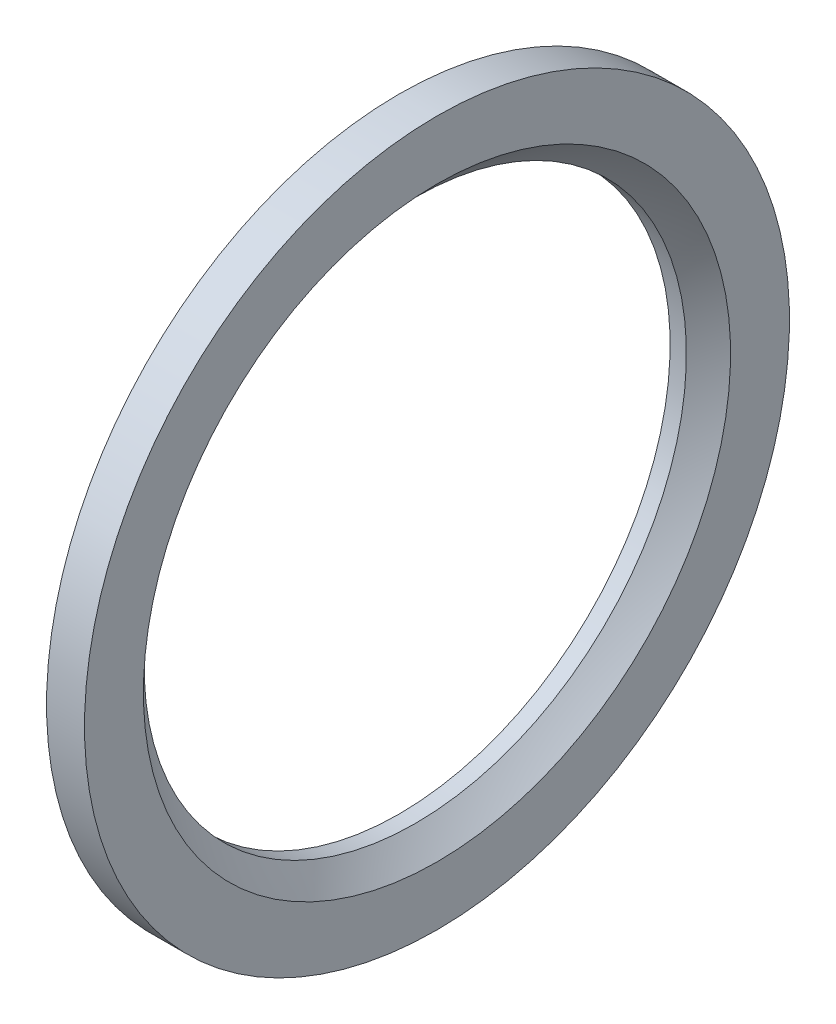
ISO-10303-21;
HEADER;
FILE_DESCRIPTION(('STEP AP214'),'2;1');
FILE_NAME('part.step','',(''),(''),'','','');
FILE_SCHEMA(('AUTOMOTIVE_DESIGN { 1 0 10303 214 1 1 1 1 }'));
ENDSEC;
DATA;
#1=APPLICATION_CONTEXT('core data for automotive mechanical design processes');
#2=APPLICATION_PROTOCOL_DEFINITION('international standard','automotive_design',2000,#1);
#3=PRODUCT_CONTEXT('',#1,'mechanical');
#4=PRODUCT('Part','Part','',(#3));
#5=PRODUCT_RELATED_PRODUCT_CATEGORY('part','',(#4));
#6=PRODUCT_DEFINITION_FORMATION('','',#4);
#7=PRODUCT_DEFINITION_CONTEXT('part definition',#1,'design');
#8=PRODUCT_DEFINITION('design','',#6,#7);
#9=PRODUCT_DEFINITION_SHAPE('','',#8);
#10=(LENGTH_UNIT() NAMED_UNIT(*) SI_UNIT(.MILLI.,.METRE.));
#11=(NAMED_UNIT(*) PLANE_ANGLE_UNIT() SI_UNIT($,.RADIAN.));
#12=(NAMED_UNIT(*) SI_UNIT($,.STERADIAN.) SOLID_ANGLE_UNIT());
#13=UNCERTAINTY_MEASURE_WITH_UNIT(LENGTH_MEASURE(1.E-05),#10,'distance_accuracy_value','');
#14=(GEOMETRIC_REPRESENTATION_CONTEXT(3) GLOBAL_UNCERTAINTY_ASSIGNED_CONTEXT((#13)) GLOBAL_UNIT_ASSIGNED_CONTEXT((#10,
#11,#12)) REPRESENTATION_CONTEXT('',''));
#15=CARTESIAN_POINT('',(0.,0.,0.));
#16=DIRECTION('',(0.,0.,1.));
#17=DIRECTION('',(1.,0.,0.));
#18=AXIS2_PLACEMENT_3D('',#15,#16,#17);
#19=CARTESIAN_POINT('',(0.,0.,0.));
#20=DIRECTION('',(-1.,0.,0.));
#21=DIRECTION('',(0.,-1.,0.));
#22=AXIS2_PLACEMENT_3D('',#19,#20,#21);
#23=CYLINDRICAL_SURFACE('',#22,8.255);
#24=CARTESIAN_POINT('',(0.,0.,0.));
#25=DIRECTION('',(-1.,0.,0.));
#26=DIRECTION('',(0.,-1.,0.));
#27=AXIS2_PLACEMENT_3D('',#24,#25,#26);
#28=CIRCLE('',#27,8.255);
#29=CARTESIAN_POINT('',(0.,-8.255,0.));
#30=VERTEX_POINT('',#29);
#31=EDGE_CURVE('E60',#30,#30,#28,.T.);
#32=ORIENTED_EDGE('',*,*,#31,.F.);
#33=EDGE_LOOP('',(#32));
#34=FACE_BOUND('',#33,.T.);
#35=CARTESIAN_POINT('',(0.889,0.,0.));
#36=DIRECTION('',(-1.,0.,0.));
#37=DIRECTION('',(0.,-1.,0.));
#38=AXIS2_PLACEMENT_3D('',#35,#36,#37);
#39=CIRCLE('',#38,8.255);
#40=CARTESIAN_POINT('',(0.889,-8.255,0.));
#41=VERTEX_POINT('',#40);
#42=EDGE_CURVE('E10',#41,#41,#39,.T.);
#43=ORIENTED_EDGE('',*,*,#42,.T.);
#44=EDGE_LOOP('',(#43));
#45=FACE_BOUND('',#44,.T.);
#46=ADVANCED_FACE('F37',(#34,#45),#23,.T.);
#47=CARTESIAN_POINT('',(0.889,6.87586678767258,0.));
#48=DIRECTION('',(-1.,0.,0.));
#49=DIRECTION('',(0.,-1.,0.));
#50=AXIS2_PLACEMENT_3D('',#47,#48,#49);
#51=PLANE('',#50);
#52=ORIENTED_EDGE('',*,*,#42,.F.);
#53=EDGE_LOOP('',(#52));
#54=FACE_BOUND('',#53,.T.);
#55=CARTESIAN_POINT('',(0.889,0.,0.));
#56=DIRECTION('',(-1.,0.,0.));
#57=DIRECTION('',(0.,-1.,0.));
#58=AXIS2_PLACEMENT_3D('',#55,#56,#57);
#59=CIRCLE('',#58,6.87586678767258);
#60=CARTESIAN_POINT('',(0.889,6.87586678767258,0.));
#61=VERTEX_POINT('',#60);
#62=EDGE_CURVE('E44',#61,#61,#59,.T.);
#63=ORIENTED_EDGE('',*,*,#62,.T.);
#64=EDGE_LOOP('',(#63));
#65=FACE_BOUND('',#64,.T.);
#66=ADVANCED_FACE('F68',(#54,#65),#51,.F.);
#67=CARTESIAN_POINT('',(7.48051582856183,0.,0.));
#68=DIRECTION('',(-1.,0.,0.));
#69=DIRECTION('',(0.,1.,0.));
#70=AXIS2_PLACEMENT_3D('',#67,#68,#69);
#71=SPHERICAL_SURFACE('',#70,9.525);
#72=CARTESIAN_POINT('',(0.381,0.,0.));
#73=DIRECTION('',(-1.,0.,0.));
#74=DIRECTION('',(0.,-1.,0.));
#75=AXIS2_PLACEMENT_3D('',#72,#73,#74);
#76=CIRCLE('',#75,6.35);
#77=CARTESIAN_POINT('',(0.381,6.35,0.));
#78=VERTEX_POINT('',#77);
#79=EDGE_CURVE('E49',#78,#78,#76,.T.);
#80=CARTESIAN_POINT('',(0.889,6.87586678767258,0.));
#81=CARTESIAN_POINT('',(0.883500637455799,6.87059485088315,0.));
#82=CARTESIAN_POINT('',(0.87800759973084,6.86531631642864,0.));
#83=CARTESIAN_POINT('',(0.867034205486401,6.85474608263887,0.));
#84=CARTESIAN_POINT('',(0.861553848966921,6.84945438330361,0.));
#85=CARTESIAN_POINT('',(0.850605848700433,6.83885785020174,0.));
#86=CARTESIAN_POINT('',(0.845138204953426,6.83355301643513,0.));
#87=CARTESIAN_POINT('',(0.834215661706124,6.8229302450159,0.));
#88=CARTESIAN_POINT('',(0.828760762205828,6.81761230736328,0.));
#89=CARTESIAN_POINT('',(0.817863738858063,6.80696335878736,0.));
#90=CARTESIAN_POINT('',(0.812421615010594,6.80163234786407,0.));
#91=CARTESIAN_POINT('',(0.801550174299633,6.79095728343886,0.));
#92=CARTESIAN_POINT('',(0.796120857436141,6.78561322993695,0.));
#93=CARTESIAN_POINT('',(0.785275061950937,6.77491211112126,0.));
#94=CARTESIAN_POINT('',(0.779858583329223,6.76955504580749,0.));
#95=CARTESIAN_POINT('',(0.769038495511359,6.75882793420986,0.));
#96=CARTESIAN_POINT('',(0.763634886315207,6.753457887926,0.));
#97=CARTESIAN_POINT('',(0.752840568458189,6.74270484530468,0.));
#98=CARTESIAN_POINT('',(0.747449859797321,6.73732184896722,0.));
#99=CARTESIAN_POINT('',(0.73668137404631,6.72654293722973,0.));
#100=CARTESIAN_POINT('',(0.731303596956167,6.72114702182971,0.));
#101=CARTESIAN_POINT('',(0.7205610053076,6.71034230303252,0.));
#102=CARTESIAN_POINT('',(0.715196190749176,6.70493349963535,0.));
#103=CARTESIAN_POINT('',(0.704479555050412,6.69410303598349,0.));
#104=CARTESIAN_POINT('',(0.699127733910072,6.6886813757288,0.));
#105=CARTESIAN_POINT('',(0.688437115859037,6.67782522957553,0.));
#106=CARTESIAN_POINT('',(0.683098318948342,6.67239074367695,0.));
#107=CARTESIAN_POINT('',(0.672433780093171,6.66150897752338,0.));
#108=CARTESIAN_POINT('',(0.667108038148696,6.6560616972684,0.));
#109=CARTESIAN_POINT('',(0.656469639887384,6.64515437376316,0.));
#110=CARTESIAN_POINT('',(0.651156983570547,6.6396943305129,0.));
#111=CARTESIAN_POINT('',(0.640544787150588,6.62876151245174,0.));
#112=CARTESIAN_POINT('',(0.635245247047467,6.62328873764083,0.));
#113=CARTESIAN_POINT('',(0.624659313565508,6.61233048796628,0.));
#114=CARTESIAN_POINT('',(0.619372920186671,6.60684501310263,0.));
#115=CARTESIAN_POINT('',(0.608813310588158,6.59586139490364,0.));
#116=CARTESIAN_POINT('',(0.603540094368483,6.59036325156829,0.));
#117=CARTESIAN_POINT('',(0.59300686944731,6.57935432807985,0.));
#118=CARTESIAN_POINT('',(0.587746860745811,6.57384354792676,0.));
#119=CARTESIAN_POINT('',(0.577240081143968,6.56280938252957,0.));
#120=CARTESIAN_POINT('',(0.571993310243623,6.55728599728547,0.));
#121=CARTESIAN_POINT('',(0.561513036450849,6.54622665350554,0.));
#122=CARTESIAN_POINT('',(0.55627953355842,6.54069069496971,0.));
#123=CARTESIAN_POINT('',(0.545825825911855,6.529606236478,0.));
#124=CARTESIAN_POINT('',(0.540605621157719,6.52405773652212,0.));
#125=CARTESIAN_POINT('',(0.530178539841557,6.51294822713419,0.));
#126=CARTESIAN_POINT('',(0.524971663279532,6.50738721770214,0.));
#127=CARTESIAN_POINT('',(0.514571268324673,6.49625272137778,0.));
#128=CARTESIAN_POINT('',(0.50937774993184,6.49067923448547,0.));
#129=CARTESIAN_POINT('',(0.499004101215546,6.47951981532831,0.));
#130=CARTESIAN_POINT('',(0.493823970892085,6.47393388306346,0.));
#131=CARTESIAN_POINT('',(0.483477128137628,6.46274960532062,0.));
#132=CARTESIAN_POINT('',(0.478310415706633,6.45715125984264,0.));
#133=CARTESIAN_POINT('',(0.467990438482981,6.44594218790436,0.));
#134=CARTESIAN_POINT('',(0.462837173690324,6.44033146144406,0.));
#135=CARTESIAN_POINT('',(0.452544121411692,6.42909765984337,0.));
#136=CARTESIAN_POINT('',(0.447404333925717,6.42347458470298,0.));
#137=CARTESIAN_POINT('',(0.437138265851606,6.41221611811503,0.));
#138=CARTESIAN_POINT('',(0.432011985263469,6.40658072666748,0.));
#139=CARTESIAN_POINT('',(0.421772960496921,6.39529765991041,0.));
#140=CARTESIAN_POINT('',(0.416660216318509,6.3896499846009,0.));
#141=CARTESIAN_POINT('',(0.406448293810988,6.37834238263079,0.));
#142=CARTESIAN_POINT('',(0.401349115481879,6.37268245597019,0.));
#143=CARTESIAN_POINT('',(0.391164354013463,6.36135038389815,0.));
#144=CARTESIAN_POINT('',(0.386078770874156,6.35567823848672,0.));
#145=CARTESIAN_POINT('',(0.381,6.35,0.));
#146=B_SPLINE_CURVE_WITH_KNOTS('',3,(#80,#81,#82,#83,#84,#85,#86,#87,#88,#89,#90,#91,#92,#93,
#94,#95,#96,#97,#98,#99,#100,#101,#102,#103,#104,#105,#106,#107,#108,#109,#110,#111,#112,#113,
#114,#115,#116,#117,#118,#119,#120,#121,#122,#123,#124,#125,#126,#127,#128,#129,#130,#131,#132,
#133,#134,#135,#136,#137,#138,#139,#140,#141,#142,#143,#144,#145),.UNSPECIFIED.,.F.,.F.,(4,2,2,
2,2,2,2,2,2,2,2,2,2,2,2,2,2,2,2,2,2,2,2,2,2,2,2,2,2,2,2,2,4),(0.,0.0228544635145267,
0.0457089270290529,0.0685633905435808,0.0914178540581085,0.114272317572633,0.137126781087162,
0.159981244601689,0.182835708116216,0.205690171630742,0.228544635145269,0.251399098659796,
0.274253562174322,0.29710802568885,0.319962489203376,0.342816952717903,0.36567141623243,
0.388525879746957,0.411380343261484,0.434234806776011,0.457089270290538,0.479943733805064,
0.502798197319591,0.525652660834118,0.548507124348645,0.571361587863172,0.594216051377699,
0.617070514892226,0.639924978406753,0.66277944192128,0.685633905435807,0.708488368950333,
0.731342832464861),.UNSPECIFIED.);
#147=EDGE_CURVE('BSEAM72',#61,#78,#146,.T.);
#148=ORIENTED_EDGE('',*,*,#62,.F.);
#149=ORIENTED_EDGE('',*,*,#79,.T.);
#150=ORIENTED_EDGE('',*,*,#147,.T.);
#151=ORIENTED_EDGE('',*,*,#147,.F.);
#152=EDGE_LOOP('',(#148,#150,#149,#151));
#153=FACE_BOUND('',#152,.T.);
#154=ADVANCED_FACE('F72',(#153),#71,.F.);
#155=CARTESIAN_POINT('',(0.,0.,0.));
#156=DIRECTION('',(-1.,0.,0.));
#157=DIRECTION('',(0.,-1.,0.));
#158=AXIS2_PLACEMENT_3D('',#155,#156,#157);
#159=CYLINDRICAL_SURFACE('',#158,6.35);
#160=ORIENTED_EDGE('',*,*,#79,.F.);
#161=EDGE_LOOP('',(#160));
#162=FACE_BOUND('',#161,.T.);
#163=CARTESIAN_POINT('',(0.,0.,0.));
#164=DIRECTION('',(-1.,0.,0.));
#165=DIRECTION('',(0.,-1.,0.));
#166=AXIS2_PLACEMENT_3D('',#163,#164,#165);
#167=CIRCLE('',#166,6.35);
#168=CARTESIAN_POINT('',(0.,-6.35,0.));
#169=VERTEX_POINT('',#168);
#170=EDGE_CURVE('E54',#169,#169,#167,.T.);
#171=ORIENTED_EDGE('',*,*,#170,.T.);
#172=EDGE_LOOP('',(#171));
#173=FACE_BOUND('',#172,.T.);
#174=ADVANCED_FACE('F77',(#162,#173),#159,.F.);
#175=CARTESIAN_POINT('',(0.,6.35,0.));
#176=DIRECTION('',(1.,0.,0.));
#177=DIRECTION('',(0.,1.,0.));
#178=AXIS2_PLACEMENT_3D('',#175,#176,#177);
#179=PLANE('',#178);
#180=ORIENTED_EDGE('',*,*,#170,.F.);
#181=EDGE_LOOP('',(#180));
#182=FACE_BOUND('',#181,.T.);
#183=ORIENTED_EDGE('',*,*,#31,.T.);
#184=EDGE_LOOP('',(#183));
#185=FACE_BOUND('',#184,.T.);
#186=ADVANCED_FACE('F65',(#182,#185),#179,.F.);
#187=CLOSED_SHELL('',(#46,#66,#154,#174,#186));
#188=MANIFOLD_SOLID_BREP('B2',#187);
#189=ADVANCED_BREP_SHAPE_REPRESENTATION('',(#18,#188),#14);
#190=SHAPE_DEFINITION_REPRESENTATION(#9,#189);
ENDSEC;
END-ISO-10303-21;
